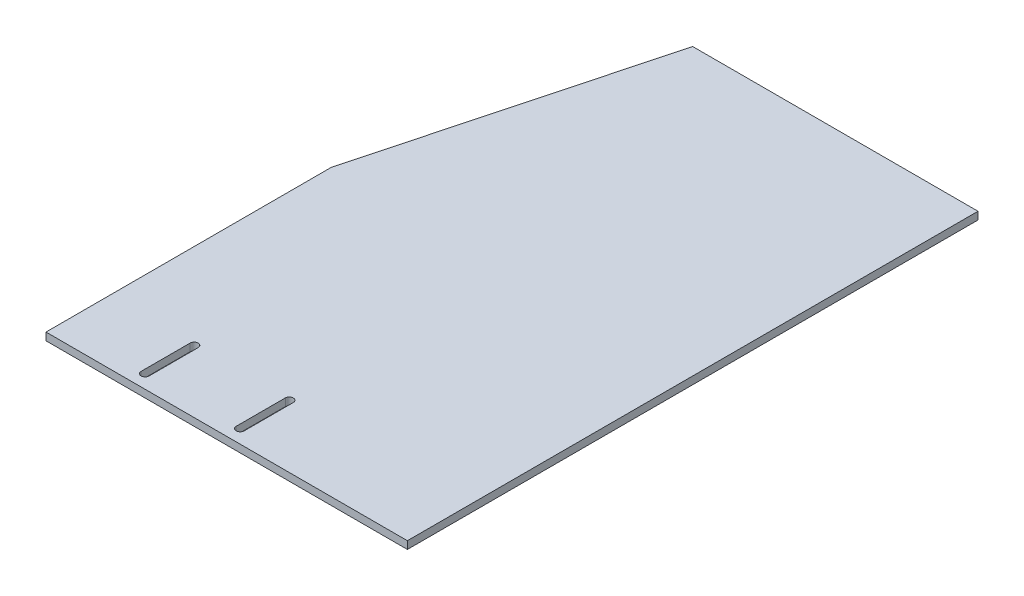
ISO-10303-21;
HEADER;
FILE_DESCRIPTION(('STEP AP214'),'2;1');
FILE_NAME('part.step','',(''),(''),'','','');
FILE_SCHEMA(('AUTOMOTIVE_DESIGN { 1 0 10303 214 1 1 1 1 }'));
ENDSEC;
DATA;
#1=APPLICATION_CONTEXT('core data for automotive mechanical design processes');
#2=APPLICATION_PROTOCOL_DEFINITION('international standard','automotive_design',2000,#1);
#3=PRODUCT_CONTEXT('',#1,'mechanical');
#4=PRODUCT('Part','Part','',(#3));
#5=PRODUCT_RELATED_PRODUCT_CATEGORY('part','',(#4));
#6=PRODUCT_DEFINITION_FORMATION('','',#4);
#7=PRODUCT_DEFINITION_CONTEXT('part definition',#1,'design');
#8=PRODUCT_DEFINITION('design','',#6,#7);
#9=PRODUCT_DEFINITION_SHAPE('','',#8);
#10=(LENGTH_UNIT() NAMED_UNIT(*) SI_UNIT(.MILLI.,.METRE.));
#11=(NAMED_UNIT(*) PLANE_ANGLE_UNIT() SI_UNIT($,.RADIAN.));
#12=(NAMED_UNIT(*) SI_UNIT($,.STERADIAN.) SOLID_ANGLE_UNIT());
#13=UNCERTAINTY_MEASURE_WITH_UNIT(LENGTH_MEASURE(1.E-05),#10,'distance_accuracy_value','');
#14=(GEOMETRIC_REPRESENTATION_CONTEXT(3) GLOBAL_UNCERTAINTY_ASSIGNED_CONTEXT((#13)) GLOBAL_UNIT_ASSIGNED_CONTEXT((#10,
#11,#12)) REPRESENTATION_CONTEXT('',''));
#15=CARTESIAN_POINT('',(0.,0.,0.));
#16=DIRECTION('',(0.,0.,1.));
#17=DIRECTION('',(1.,0.,0.));
#18=AXIS2_PLACEMENT_3D('',#15,#16,#17);
#19=CARTESIAN_POINT('',(0.,4.,0.));
#20=DIRECTION('',(0.,1.,0.));
#21=DIRECTION('',(0.,0.,1.));
#22=AXIS2_PLACEMENT_3D('',#19,#20,#21);
#23=PLANE('',#22);
#24=DIRECTION('',(-0.257662650560332,0.,0.966234939601246));
#25=VECTOR('',#24,1.);
#26=CARTESIAN_POINT('',(40.,4.,-150.));
#27=LINE('',#26,#25);
#28=CARTESIAN_POINT('',(40.,4.,-150.));
#29=VERTEX_POINT('',#28);
#30=CARTESIAN_POINT('',(0.,4.,0.));
#31=VERTEX_POINT('',#30);
#32=EDGE_CURVE('E201',#29,#31,#27,.T.);
#33=ORIENTED_EDGE('',*,*,#32,.T.);
#34=DIRECTION('',(0.,0.,1.));
#35=VECTOR('',#34,1.);
#36=CARTESIAN_POINT('',(0.,4.,0.));
#37=LINE('',#36,#35);
#38=CARTESIAN_POINT('',(0.,4.,150.));
#39=VERTEX_POINT('',#38);
#40=EDGE_CURVE('E204',#31,#39,#37,.T.);
#41=ORIENTED_EDGE('',*,*,#40,.T.);
#42=DIRECTION('',(1.,0.,0.));
#43=VECTOR('',#42,1.);
#44=CARTESIAN_POINT('',(0.,4.,150.));
#45=LINE('',#44,#43);
#46=CARTESIAN_POINT('',(190.,4.,150.));
#47=VERTEX_POINT('',#46);
#48=EDGE_CURVE('E207',#39,#47,#45,.T.);
#49=ORIENTED_EDGE('',*,*,#48,.T.);
#50=DIRECTION('',(0.,0.,-1.));
#51=VECTOR('',#50,1.);
#52=CARTESIAN_POINT('',(190.,4.,150.));
#53=LINE('',#52,#51);
#54=CARTESIAN_POINT('',(190.,4.,-150.));
#55=VERTEX_POINT('',#54);
#56=EDGE_CURVE('E209',#47,#55,#53,.T.);
#57=ORIENTED_EDGE('',*,*,#56,.T.);
#58=DIRECTION('',(-1.,0.,0.));
#59=VECTOR('',#58,1.);
#60=CARTESIAN_POINT('',(190.,4.,-150.));
#61=LINE('',#60,#59);
#62=EDGE_CURVE('E211',#55,#29,#61,.T.);
#63=ORIENTED_EDGE('',*,*,#62,.T.);
#64=EDGE_LOOP('',(#33,#41,#49,#57,#63));
#65=FACE_BOUND('',#64,.T.);
#66=DIRECTION('',(0.,0.,-1.));
#67=VECTOR('',#66,1.);
#68=CARTESIAN_POINT('',(97.1,4.,142.9));
#69=LINE('',#68,#67);
#70=CARTESIAN_POINT('',(97.1,4.,142.9));
#71=VERTEX_POINT('',#70);
#72=CARTESIAN_POINT('',(97.1,4.,117.099999999999));
#73=VERTEX_POINT('',#72);
#74=EDGE_CURVE('E172',#71,#73,#69,.T.);
#75=ORIENTED_EDGE('',*,*,#74,.F.);
#76=CARTESIAN_POINT('',(95.,4.,142.9));
#77=DIRECTION('',(0.,1.,0.));
#78=DIRECTION('',(0.,0.,-1.));
#79=AXIS2_PLACEMENT_3D('',#76,#77,#78);
#80=CIRCLE('',#79,2.09999999999994);
#81=CARTESIAN_POINT('',(92.9000000000001,4.,142.9));
#82=VERTEX_POINT('',#81);
#83=EDGE_CURVE('E170',#82,#71,#80,.T.);
#84=ORIENTED_EDGE('',*,*,#83,.F.);
#85=DIRECTION('',(0.,0.,1.));
#86=VECTOR('',#85,1.);
#87=CARTESIAN_POINT('',(92.9000000000001,4.,142.9));
#88=LINE('',#87,#86);
#89=CARTESIAN_POINT('',(92.9000000000001,4.,117.099999999999));
#90=VERTEX_POINT('',#89);
#91=EDGE_CURVE('E178',#90,#82,#88,.T.);
#92=ORIENTED_EDGE('',*,*,#91,.F.);
#93=CARTESIAN_POINT('',(95.,4.,117.099999999999));
#94=DIRECTION('',(0.,1.,0.));
#95=DIRECTION('',(0.,0.,-1.));
#96=AXIS2_PLACEMENT_3D('',#93,#94,#95);
#97=CIRCLE('',#96,2.09999999999995);
#98=EDGE_CURVE('E175',#73,#90,#97,.T.);
#99=ORIENTED_EDGE('',*,*,#98,.F.);
#100=EDGE_LOOP('',(#75,#84,#92,#99));
#101=FACE_BOUND('',#100,.T.);
#102=DIRECTION('',(0.,0.,-1.));
#103=VECTOR('',#102,1.);
#104=CARTESIAN_POINT('',(47.1,4.,142.9));
#105=LINE('',#104,#103);
#106=CARTESIAN_POINT('',(47.1,4.,142.9));
#107=VERTEX_POINT('',#106);
#108=CARTESIAN_POINT('',(47.1,4.,117.099999999999));
#109=VERTEX_POINT('',#108);
#110=EDGE_CURVE('E142',#107,#109,#105,.T.);
#111=ORIENTED_EDGE('',*,*,#110,.F.);
#112=CARTESIAN_POINT('',(45.,4.,142.9));
#113=DIRECTION('',(0.,1.,0.));
#114=DIRECTION('',(0.,0.,1.));
#115=AXIS2_PLACEMENT_3D('',#112,#113,#114);
#116=CIRCLE('',#115,2.09999999999994);
#117=CARTESIAN_POINT('',(42.9000000000001,4.,142.9));
#118=VERTEX_POINT('',#117);
#119=EDGE_CURVE('E134',#118,#107,#116,.T.);
#120=ORIENTED_EDGE('',*,*,#119,.F.);
#121=DIRECTION('',(0.,0.,1.));
#122=VECTOR('',#121,1.);
#123=CARTESIAN_POINT('',(42.9000000000001,4.,142.9));
#124=LINE('',#123,#122);
#125=CARTESIAN_POINT('',(42.9000000000001,4.,117.099999999999));
#126=VERTEX_POINT('',#125);
#127=EDGE_CURVE('E156',#126,#118,#124,.T.);
#128=ORIENTED_EDGE('',*,*,#127,.F.);
#129=CARTESIAN_POINT('',(45.0000000000001,4.,117.099999999999));
#130=DIRECTION('',(0.,1.,0.));
#131=DIRECTION('',(0.,0.,1.));
#132=AXIS2_PLACEMENT_3D('',#129,#130,#131);
#133=CIRCLE('',#132,2.09999999999995);
#134=EDGE_CURVE('E154',#109,#126,#133,.T.);
#135=ORIENTED_EDGE('',*,*,#134,.F.);
#136=EDGE_LOOP('',(#111,#120,#128,#135));
#137=FACE_BOUND('',#136,.T.);
#138=ADVANCED_FACE('F39',(#65,#101,#137),#23,.T.);
#139=CARTESIAN_POINT('',(0.,0.,0.));
#140=DIRECTION('',(0.,1.,0.));
#141=DIRECTION('',(0.,0.,1.));
#142=AXIS2_PLACEMENT_3D('',#139,#140,#141);
#143=PLANE('',#142);
#144=CARTESIAN_POINT('',(95.,0.,142.9));
#145=DIRECTION('',(0.,1.,0.));
#146=DIRECTION('',(0.,0.,-1.));
#147=AXIS2_PLACEMENT_3D('',#144,#145,#146);
#148=CIRCLE('',#147,2.09999999999994);
#149=CARTESIAN_POINT('',(92.9000000000001,0.,142.9));
#150=VERTEX_POINT('',#149);
#151=CARTESIAN_POINT('',(97.1,0.,142.9));
#152=VERTEX_POINT('',#151);
#153=EDGE_CURVE('E150',#150,#152,#148,.T.);
#154=ORIENTED_EDGE('',*,*,#153,.T.);
#155=DIRECTION('',(0.,0.,-1.));
#156=VECTOR('',#155,1.);
#157=CARTESIAN_POINT('',(97.1,0.,142.9));
#158=LINE('',#157,#156);
#159=CARTESIAN_POINT('',(97.1,0.,117.099999999999));
#160=VERTEX_POINT('',#159);
#161=EDGE_CURVE('E183',#152,#160,#158,.T.);
#162=ORIENTED_EDGE('',*,*,#161,.T.);
#163=CARTESIAN_POINT('',(95.,0.,117.099999999999));
#164=DIRECTION('',(0.,1.,0.));
#165=DIRECTION('',(0.,0.,-1.));
#166=AXIS2_PLACEMENT_3D('',#163,#164,#165);
#167=CIRCLE('',#166,2.09999999999995);
#168=CARTESIAN_POINT('',(92.9,0.,117.099999999999));
#169=VERTEX_POINT('',#168);
#170=EDGE_CURVE('E186',#160,#169,#167,.T.);
#171=ORIENTED_EDGE('',*,*,#170,.T.);
#172=DIRECTION('',(0.,0.,1.));
#173=VECTOR('',#172,1.);
#174=CARTESIAN_POINT('',(92.9000000000001,0.,142.9));
#175=LINE('',#174,#173);
#176=EDGE_CURVE('E173',#169,#150,#175,.T.);
#177=ORIENTED_EDGE('',*,*,#176,.T.);
#178=EDGE_LOOP('',(#154,#162,#171,#177));
#179=FACE_BOUND('',#178,.T.);
#180=DIRECTION('',(-0.257662650560332,0.,0.966234939601246));
#181=VECTOR('',#180,1.);
#182=CARTESIAN_POINT('',(40.,0.,-150.));
#183=LINE('',#182,#181);
#184=CARTESIAN_POINT('',(40.,0.,-150.));
#185=VERTEX_POINT('',#184);
#186=CARTESIAN_POINT('',(0.,0.,0.));
#187=VERTEX_POINT('',#186);
#188=EDGE_CURVE('E200',#185,#187,#183,.T.);
#189=ORIENTED_EDGE('',*,*,#188,.F.);
#190=DIRECTION('',(-1.,0.,0.));
#191=VECTOR('',#190,1.);
#192=CARTESIAN_POINT('',(190.,0.,-150.));
#193=LINE('',#192,#191);
#194=CARTESIAN_POINT('',(190.,0.,-150.));
#195=VERTEX_POINT('',#194);
#196=EDGE_CURVE('E205',#195,#185,#193,.T.);
#197=ORIENTED_EDGE('',*,*,#196,.F.);
#198=DIRECTION('',(0.,0.,-1.));
#199=VECTOR('',#198,1.);
#200=CARTESIAN_POINT('',(190.,0.,150.));
#201=LINE('',#200,#199);
#202=CARTESIAN_POINT('',(190.,0.,150.));
#203=VERTEX_POINT('',#202);
#204=EDGE_CURVE('E220',#203,#195,#201,.T.);
#205=ORIENTED_EDGE('',*,*,#204,.F.);
#206=DIRECTION('',(1.,0.,0.));
#207=VECTOR('',#206,1.);
#208=CARTESIAN_POINT('',(0.,0.,150.));
#209=LINE('',#208,#207);
#210=CARTESIAN_POINT('',(0.,0.,150.));
#211=VERTEX_POINT('',#210);
#212=EDGE_CURVE('E218',#211,#203,#209,.T.);
#213=ORIENTED_EDGE('',*,*,#212,.F.);
#214=DIRECTION('',(0.,0.,1.));
#215=VECTOR('',#214,1.);
#216=CARTESIAN_POINT('',(0.,0.,0.));
#217=LINE('',#216,#215);
#218=EDGE_CURVE('E216',#187,#211,#217,.T.);
#219=ORIENTED_EDGE('',*,*,#218,.F.);
#220=EDGE_LOOP('',(#189,#197,#205,#213,#219));
#221=FACE_BOUND('',#220,.T.);
#222=CARTESIAN_POINT('',(45.,0.,142.9));
#223=DIRECTION('',(0.,1.,0.));
#224=DIRECTION('',(0.,0.,1.));
#225=AXIS2_PLACEMENT_3D('',#222,#223,#224);
#226=CIRCLE('',#225,2.09999999999994);
#227=CARTESIAN_POINT('',(42.9000000000001,0.,142.9));
#228=VERTEX_POINT('',#227);
#229=CARTESIAN_POINT('',(47.1,0.,142.9));
#230=VERTEX_POINT('',#229);
#231=EDGE_CURVE('E62',#228,#230,#226,.T.);
#232=ORIENTED_EDGE('',*,*,#231,.T.);
#233=DIRECTION('',(0.,0.,-1.));
#234=VECTOR('',#233,1.);
#235=CARTESIAN_POINT('',(47.1,0.,142.9));
#236=LINE('',#235,#234);
#237=CARTESIAN_POINT('',(47.1,0.,117.099999999999));
#238=VERTEX_POINT('',#237);
#239=EDGE_CURVE('E149',#230,#238,#236,.T.);
#240=ORIENTED_EDGE('',*,*,#239,.T.);
#241=CARTESIAN_POINT('',(45.0000000000001,0.,117.099999999999));
#242=DIRECTION('',(0.,1.,0.));
#243=DIRECTION('',(0.,0.,1.));
#244=AXIS2_PLACEMENT_3D('',#241,#242,#243);
#245=CIRCLE('',#244,2.09999999999995);
#246=CARTESIAN_POINT('',(42.9000000000001,0.,117.099999999999));
#247=VERTEX_POINT('',#246);
#248=EDGE_CURVE('E162',#238,#247,#245,.T.);
#249=ORIENTED_EDGE('',*,*,#248,.T.);
#250=DIRECTION('',(0.,0.,1.));
#251=VECTOR('',#250,1.);
#252=CARTESIAN_POINT('',(42.9000000000001,0.,142.9));
#253=LINE('',#252,#251);
#254=EDGE_CURVE('E143',#247,#228,#253,.T.);
#255=ORIENTED_EDGE('',*,*,#254,.T.);
#256=EDGE_LOOP('',(#232,#240,#249,#255));
#257=FACE_BOUND('',#256,.T.);
#258=ADVANCED_FACE('F241',(#179,#221,#257),#143,.F.);
#259=CARTESIAN_POINT('',(40.,4.,-150.));
#260=DIRECTION('',(0.966234939601246,0.,0.257662650560332));
#261=DIRECTION('',(0.257662650560332,0.,-0.966234939601246));
#262=AXIS2_PLACEMENT_3D('',#259,#260,#261);
#263=PLANE('',#262);
#264=ORIENTED_EDGE('',*,*,#188,.T.);
#265=DIRECTION('',(0.,-1.,0.));
#266=VECTOR('',#265,1.);
#267=CARTESIAN_POINT('',(0.,4.,0.));
#268=LINE('',#267,#266);
#269=EDGE_CURVE('E11',#31,#187,#268,.T.);
#270=ORIENTED_EDGE('',*,*,#269,.F.);
#271=ORIENTED_EDGE('',*,*,#32,.F.);
#272=DIRECTION('',(0.,-1.,0.));
#273=VECTOR('',#272,1.);
#274=CARTESIAN_POINT('',(40.,4.,-150.));
#275=LINE('',#274,#273);
#276=EDGE_CURVE('E213',#29,#185,#275,.T.);
#277=ORIENTED_EDGE('',*,*,#276,.T.);
#278=EDGE_LOOP('',(#264,#270,#271,#277));
#279=FACE_BOUND('',#278,.T.);
#280=ADVANCED_FACE('F41',(#279),#263,.F.);
#281=CARTESIAN_POINT('',(0.,4.,0.));
#282=DIRECTION('',(1.,0.,0.));
#283=DIRECTION('',(0.,0.,-1.));
#284=AXIS2_PLACEMENT_3D('',#281,#282,#283);
#285=PLANE('',#284);
#286=ORIENTED_EDGE('',*,*,#218,.T.);
#287=DIRECTION('',(0.,-1.,0.));
#288=VECTOR('',#287,1.);
#289=CARTESIAN_POINT('',(0.,4.,150.));
#290=LINE('',#289,#288);
#291=EDGE_CURVE('E47',#39,#211,#290,.T.);
#292=ORIENTED_EDGE('',*,*,#291,.F.);
#293=ORIENTED_EDGE('',*,*,#40,.F.);
#294=ORIENTED_EDGE('',*,*,#269,.T.);
#295=EDGE_LOOP('',(#286,#292,#293,#294));
#296=FACE_BOUND('',#295,.T.);
#297=ADVANCED_FACE('F256',(#296),#285,.F.);
#298=CARTESIAN_POINT('',(0.,4.,150.));
#299=DIRECTION('',(0.,0.,-1.));
#300=DIRECTION('',(-1.,0.,0.));
#301=AXIS2_PLACEMENT_3D('',#298,#299,#300);
#302=PLANE('',#301);
#303=ORIENTED_EDGE('',*,*,#212,.T.);
#304=DIRECTION('',(0.,-1.,0.));
#305=VECTOR('',#304,1.);
#306=CARTESIAN_POINT('',(190.,4.,150.));
#307=LINE('',#306,#305);
#308=EDGE_CURVE('E228',#47,#203,#307,.T.);
#309=ORIENTED_EDGE('',*,*,#308,.F.);
#310=ORIENTED_EDGE('',*,*,#48,.F.);
#311=ORIENTED_EDGE('',*,*,#291,.T.);
#312=EDGE_LOOP('',(#303,#309,#310,#311));
#313=FACE_BOUND('',#312,.T.);
#314=ADVANCED_FACE('F235',(#313),#302,.F.);
#315=CARTESIAN_POINT('',(190.,4.,150.));
#316=DIRECTION('',(-1.,0.,0.));
#317=DIRECTION('',(0.,0.,1.));
#318=AXIS2_PLACEMENT_3D('',#315,#316,#317);
#319=PLANE('',#318);
#320=ORIENTED_EDGE('',*,*,#204,.T.);
#321=DIRECTION('',(0.,-1.,0.));
#322=VECTOR('',#321,1.);
#323=CARTESIAN_POINT('',(190.,4.,-150.));
#324=LINE('',#323,#322);
#325=EDGE_CURVE('E225',#55,#195,#324,.T.);
#326=ORIENTED_EDGE('',*,*,#325,.F.);
#327=ORIENTED_EDGE('',*,*,#56,.F.);
#328=ORIENTED_EDGE('',*,*,#308,.T.);
#329=EDGE_LOOP('',(#320,#326,#327,#328));
#330=FACE_BOUND('',#329,.T.);
#331=ADVANCED_FACE('F246',(#330),#319,.F.);
#332=CARTESIAN_POINT('',(190.,4.,-150.));
#333=DIRECTION('',(0.,0.,1.));
#334=DIRECTION('',(1.,0.,0.));
#335=AXIS2_PLACEMENT_3D('',#332,#333,#334);
#336=PLANE('',#335);
#337=ORIENTED_EDGE('',*,*,#196,.T.);
#338=ORIENTED_EDGE('',*,*,#276,.F.);
#339=ORIENTED_EDGE('',*,*,#62,.F.);
#340=ORIENTED_EDGE('',*,*,#325,.T.);
#341=EDGE_LOOP('',(#337,#338,#339,#340));
#342=FACE_BOUND('',#341,.T.);
#343=ADVANCED_FACE('F250',(#342),#336,.F.);
#344=CARTESIAN_POINT('',(95.,4.,142.9));
#345=DIRECTION('',(0.,-1.,0.));
#346=DIRECTION('',(0.,0.,-1.));
#347=AXIS2_PLACEMENT_3D('',#344,#345,#346);
#348=CYLINDRICAL_SURFACE('',#347,2.09999999999994);
#349=ORIENTED_EDGE('',*,*,#153,.F.);
#350=DIRECTION('',(0.,-1.,0.));
#351=VECTOR('',#350,1.);
#352=CARTESIAN_POINT('',(92.9000000000001,4.,142.9));
#353=LINE('',#352,#351);
#354=EDGE_CURVE('E180',#82,#150,#353,.T.);
#355=ORIENTED_EDGE('',*,*,#354,.F.);
#356=ORIENTED_EDGE('',*,*,#83,.T.);
#357=DIRECTION('',(0.,-1.,0.));
#358=VECTOR('',#357,1.);
#359=CARTESIAN_POINT('',(97.1,4.,142.9));
#360=LINE('',#359,#358);
#361=EDGE_CURVE('E197',#71,#152,#360,.T.);
#362=ORIENTED_EDGE('',*,*,#361,.T.);
#363=EDGE_LOOP('',(#349,#355,#356,#362));
#364=FACE_BOUND('',#363,.T.);
#365=ADVANCED_FACE('F270',(#364),#348,.F.);
#366=CARTESIAN_POINT('',(97.1,4.,142.9));
#367=DIRECTION('',(-1.,0.,0.));
#368=DIRECTION('',(0.,0.,1.));
#369=AXIS2_PLACEMENT_3D('',#366,#367,#368);
#370=PLANE('',#369);
#371=ORIENTED_EDGE('',*,*,#161,.F.);
#372=ORIENTED_EDGE('',*,*,#361,.F.);
#373=ORIENTED_EDGE('',*,*,#74,.T.);
#374=DIRECTION('',(0.,-1.,0.));
#375=VECTOR('',#374,1.);
#376=CARTESIAN_POINT('',(97.1,4.,117.099999999999));
#377=LINE('',#376,#375);
#378=EDGE_CURVE('E195',#73,#160,#377,.T.);
#379=ORIENTED_EDGE('',*,*,#378,.T.);
#380=EDGE_LOOP('',(#371,#372,#373,#379));
#381=FACE_BOUND('',#380,.T.);
#382=ADVANCED_FACE('F299',(#381),#370,.T.);
#383=CARTESIAN_POINT('',(95.,4.,117.099999999999));
#384=DIRECTION('',(0.,-1.,0.));
#385=DIRECTION('',(0.,0.,-1.));
#386=AXIS2_PLACEMENT_3D('',#383,#384,#385);
#387=CYLINDRICAL_SURFACE('',#386,2.09999999999995);
#388=ORIENTED_EDGE('',*,*,#170,.F.);
#389=ORIENTED_EDGE('',*,*,#378,.F.);
#390=ORIENTED_EDGE('',*,*,#98,.T.);
#391=DIRECTION('',(0.,-1.,0.));
#392=VECTOR('',#391,1.);
#393=CARTESIAN_POINT('',(92.9,4.,117.099999999999));
#394=LINE('',#393,#392);
#395=EDGE_CURVE('E193',#90,#169,#394,.T.);
#396=ORIENTED_EDGE('',*,*,#395,.T.);
#397=EDGE_LOOP('',(#388,#389,#390,#396));
#398=FACE_BOUND('',#397,.T.);
#399=ADVANCED_FACE('F307',(#398),#387,.F.);
#400=CARTESIAN_POINT('',(92.9000000000001,4.,142.9));
#401=DIRECTION('',(1.,0.,0.));
#402=DIRECTION('',(0.,0.,-1.));
#403=AXIS2_PLACEMENT_3D('',#400,#401,#402);
#404=PLANE('',#403);
#405=ORIENTED_EDGE('',*,*,#176,.F.);
#406=ORIENTED_EDGE('',*,*,#395,.F.);
#407=ORIENTED_EDGE('',*,*,#91,.T.);
#408=ORIENTED_EDGE('',*,*,#354,.T.);
#409=EDGE_LOOP('',(#405,#406,#407,#408));
#410=FACE_BOUND('',#409,.T.);
#411=ADVANCED_FACE('F315',(#410),#404,.T.);
#412=CARTESIAN_POINT('',(45.,4.,142.9));
#413=DIRECTION('',(0.,-1.,0.));
#414=DIRECTION('',(0.,0.,-1.));
#415=AXIS2_PLACEMENT_3D('',#412,#413,#414);
#416=CYLINDRICAL_SURFACE('',#415,2.09999999999994);
#417=ORIENTED_EDGE('',*,*,#231,.F.);
#418=DIRECTION('',(0.,-1.,0.));
#419=VECTOR('',#418,1.);
#420=CARTESIAN_POINT('',(42.9000000000001,4.,142.9));
#421=LINE('',#420,#419);
#422=EDGE_CURVE('E138',#118,#228,#421,.T.);
#423=ORIENTED_EDGE('',*,*,#422,.F.);
#424=ORIENTED_EDGE('',*,*,#119,.T.);
#425=DIRECTION('',(0.,-1.,0.));
#426=VECTOR('',#425,1.);
#427=CARTESIAN_POINT('',(47.1,4.,142.9));
#428=LINE('',#427,#426);
#429=EDGE_CURVE('E137',#107,#230,#428,.T.);
#430=ORIENTED_EDGE('',*,*,#429,.T.);
#431=EDGE_LOOP('',(#417,#423,#424,#430));
#432=FACE_BOUND('',#431,.T.);
#433=ADVANCED_FACE('F136',(#432),#416,.F.);
#434=CARTESIAN_POINT('',(47.1,4.,142.9));
#435=DIRECTION('',(-1.,0.,0.));
#436=DIRECTION('',(0.,0.,1.));
#437=AXIS2_PLACEMENT_3D('',#434,#435,#436);
#438=PLANE('',#437);
#439=ORIENTED_EDGE('',*,*,#239,.F.);
#440=ORIENTED_EDGE('',*,*,#429,.F.);
#441=ORIENTED_EDGE('',*,*,#110,.T.);
#442=DIRECTION('',(0.,-1.,0.));
#443=VECTOR('',#442,1.);
#444=CARTESIAN_POINT('',(47.1,4.,117.099999999999));
#445=LINE('',#444,#443);
#446=EDGE_CURVE('E151',#109,#238,#445,.T.);
#447=ORIENTED_EDGE('',*,*,#446,.T.);
#448=EDGE_LOOP('',(#439,#440,#441,#447));
#449=FACE_BOUND('',#448,.T.);
#450=ADVANCED_FACE('F146',(#449),#438,.T.);
#451=CARTESIAN_POINT('',(45.0000000000001,4.,117.099999999999));
#452=DIRECTION('',(0.,-1.,0.));
#453=DIRECTION('',(0.,0.,-1.));
#454=AXIS2_PLACEMENT_3D('',#451,#452,#453);
#455=CYLINDRICAL_SURFACE('',#454,2.09999999999995);
#456=ORIENTED_EDGE('',*,*,#248,.F.);
#457=ORIENTED_EDGE('',*,*,#446,.F.);
#458=ORIENTED_EDGE('',*,*,#134,.T.);
#459=DIRECTION('',(0.,-1.,0.));
#460=VECTOR('',#459,1.);
#461=CARTESIAN_POINT('',(42.9000000000001,4.,117.099999999999));
#462=LINE('',#461,#460);
#463=EDGE_CURVE('E54',#126,#247,#462,.T.);
#464=ORIENTED_EDGE('',*,*,#463,.T.);
#465=EDGE_LOOP('',(#456,#457,#458,#464));
#466=FACE_BOUND('',#465,.T.);
#467=ADVANCED_FACE('F339',(#466),#455,.F.);
#468=CARTESIAN_POINT('',(42.9000000000001,4.,142.9));
#469=DIRECTION('',(1.,0.,0.));
#470=DIRECTION('',(0.,0.,-1.));
#471=AXIS2_PLACEMENT_3D('',#468,#469,#470);
#472=PLANE('',#471);
#473=ORIENTED_EDGE('',*,*,#254,.F.);
#474=ORIENTED_EDGE('',*,*,#463,.F.);
#475=ORIENTED_EDGE('',*,*,#127,.T.);
#476=ORIENTED_EDGE('',*,*,#422,.T.);
#477=EDGE_LOOP('',(#473,#474,#475,#476));
#478=FACE_BOUND('',#477,.T.);
#479=ADVANCED_FACE('F347',(#478),#472,.T.);
#480=CLOSED_SHELL('',(#138,#258,#280,#297,#314,#331,#343,#365,#382,#399,#411,#433,#450,#467,#479));
#481=MANIFOLD_SOLID_BREP('B2',#480);
#482=ADVANCED_BREP_SHAPE_REPRESENTATION('',(#18,#481),#14);
#483=SHAPE_DEFINITION_REPRESENTATION(#9,#482);
ENDSEC;
END-ISO-10303-21;
